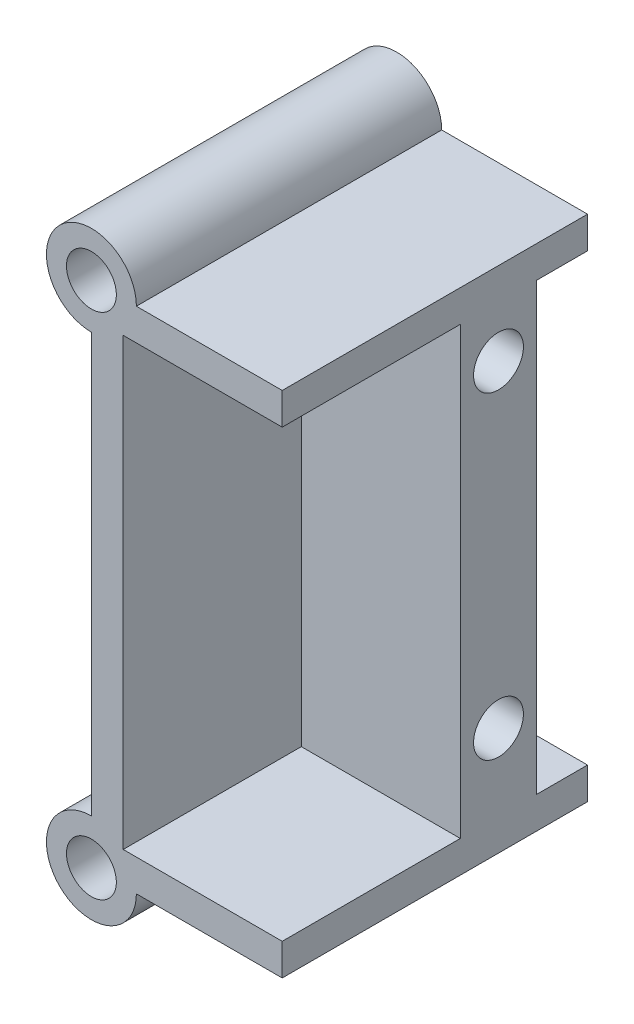
ISO-10303-21;
HEADER;
FILE_DESCRIPTION(('STEP AP214'),'2;1');
FILE_NAME('part.step','',(''),(''),'','','');
FILE_SCHEMA(('AUTOMOTIVE_DESIGN { 1 0 10303 214 1 1 1 1 }'));
ENDSEC;
DATA;
#1=APPLICATION_CONTEXT('core data for automotive mechanical design processes');
#2=APPLICATION_PROTOCOL_DEFINITION('international standard','automotive_design',2000,#1);
#3=PRODUCT_CONTEXT('',#1,'mechanical');
#4=PRODUCT('Part','Part','',(#3));
#5=PRODUCT_RELATED_PRODUCT_CATEGORY('part','',(#4));
#6=PRODUCT_DEFINITION_FORMATION('','',#4);
#7=PRODUCT_DEFINITION_CONTEXT('part definition',#1,'design');
#8=PRODUCT_DEFINITION('design','',#6,#7);
#9=PRODUCT_DEFINITION_SHAPE('','',#8);
#10=(LENGTH_UNIT() NAMED_UNIT(*) SI_UNIT(.MILLI.,.METRE.));
#11=(NAMED_UNIT(*) PLANE_ANGLE_UNIT() SI_UNIT($,.RADIAN.));
#12=(NAMED_UNIT(*) SI_UNIT($,.STERADIAN.) SOLID_ANGLE_UNIT());
#13=UNCERTAINTY_MEASURE_WITH_UNIT(LENGTH_MEASURE(1.E-05),#10,'distance_accuracy_value','');
#14=(GEOMETRIC_REPRESENTATION_CONTEXT(3) GLOBAL_UNCERTAINTY_ASSIGNED_CONTEXT((#13)) GLOBAL_UNIT_ASSIGNED_CONTEXT((#10,
#11,#12)) REPRESENTATION_CONTEXT('',''));
#15=CARTESIAN_POINT('',(0.,0.,0.));
#16=DIRECTION('',(0.,0.,1.));
#17=DIRECTION('',(1.,0.,0.));
#18=AXIS2_PLACEMENT_3D('',#15,#16,#17);
#19=CARTESIAN_POINT('',(0.,0.,30.48));
#20=DIRECTION('',(0.,-1.,0.));
#21=DIRECTION('',(0.,0.,-1.));
#22=AXIS2_PLACEMENT_3D('',#19,#20,#21);
#23=PLANE('',#22);
#24=DIRECTION('',(-1.,0.,0.));
#25=VECTOR('',#24,1.);
#26=CARTESIAN_POINT('',(60.9734134975943,0.,5.08));
#27=LINE('',#26,#25);
#28=CARTESIAN_POINT('',(15.875,0.,5.08));
#29=VERTEX_POINT('',#28);
#30=CARTESIAN_POINT('',(0.,0.,5.08));
#31=VERTEX_POINT('',#30);
#32=EDGE_CURVE('E235',#29,#31,#27,.T.);
#33=ORIENTED_EDGE('',*,*,#32,.F.);
#34=DIRECTION('',(0.,0.,-1.));
#35=VECTOR('',#34,1.);
#36=CARTESIAN_POINT('',(15.875,0.,30.48));
#37=LINE('',#36,#35);
#38=CARTESIAN_POINT('',(15.875,0.,0.));
#39=VERTEX_POINT('',#38);
#40=EDGE_CURVE('E200',#29,#39,#37,.T.);
#41=ORIENTED_EDGE('',*,*,#40,.T.);
#42=DIRECTION('',(-1.,0.,0.));
#43=VECTOR('',#42,1.);
#44=CARTESIAN_POINT('',(0.,0.,0.));
#45=LINE('',#44,#43);
#46=CARTESIAN_POINT('',(0.,0.,0.));
#47=VERTEX_POINT('',#46);
#48=EDGE_CURVE('E169',#39,#47,#45,.T.);
#49=ORIENTED_EDGE('',*,*,#48,.T.);
#50=DIRECTION('',(0.,0.,-1.));
#51=VECTOR('',#50,1.);
#52=CARTESIAN_POINT('',(0.,0.,30.48));
#53=LINE('',#52,#51);
#54=EDGE_CURVE('E196',#31,#47,#53,.T.);
#55=ORIENTED_EDGE('',*,*,#54,.F.);
#56=EDGE_LOOP('',(#33,#41,#49,#55));
#57=FACE_BOUND('',#56,.T.);
#58=ADVANCED_FACE('F37',(#57),#23,.F.);
#59=DIRECTION('',(-1.,0.,0.));
#60=VECTOR('',#59,1.);
#61=CARTESIAN_POINT('',(60.9734134975943,0.,12.7));
#62=LINE('',#61,#60);
#63=CARTESIAN_POINT('',(15.875,0.,12.7));
#64=VERTEX_POINT('',#63);
#65=CARTESIAN_POINT('',(0.,0.,12.7));
#66=VERTEX_POINT('',#65);
#67=EDGE_CURVE('E223',#64,#66,#62,.T.);
#68=ORIENTED_EDGE('',*,*,#67,.T.);
#69=CARTESIAN_POINT('',(0.,0.,30.48));
#70=VERTEX_POINT('',#69);
#71=EDGE_CURVE('E197',#70,#66,#53,.T.);
#72=ORIENTED_EDGE('',*,*,#71,.F.);
#73=DIRECTION('',(-1.,0.,0.));
#74=VECTOR('',#73,1.);
#75=CARTESIAN_POINT('',(0.,0.,30.48));
#76=LINE('',#75,#74);
#77=CARTESIAN_POINT('',(15.875,0.,30.48));
#78=VERTEX_POINT('',#77);
#79=EDGE_CURVE('E254',#78,#70,#76,.T.);
#80=ORIENTED_EDGE('',*,*,#79,.F.);
#81=EDGE_CURVE('E201',#78,#64,#37,.T.);
#82=ORIENTED_EDGE('',*,*,#81,.T.);
#83=EDGE_LOOP('',(#68,#72,#80,#82));
#84=FACE_BOUND('',#83,.T.);
#85=ADVANCED_FACE('F289',(#84),#23,.F.);
#86=CARTESIAN_POINT('',(0.,44.45,30.48));
#87=DIRECTION('',(-1.,0.,0.));
#88=DIRECTION('',(0.,0.,1.));
#89=AXIS2_PLACEMENT_3D('',#86,#87,#88);
#90=PLANE('',#89);
#91=DIRECTION('',(0.,1.,0.));
#92=VECTOR('',#91,1.);
#93=CARTESIAN_POINT('',(0.,0.,5.08));
#94=LINE('',#93,#92);
#95=CARTESIAN_POINT('',(0.,44.45,5.08));
#96=VERTEX_POINT('',#95);
#97=EDGE_CURVE('E229',#31,#96,#94,.T.);
#98=ORIENTED_EDGE('',*,*,#97,.F.);
#99=ORIENTED_EDGE('',*,*,#54,.T.);
#100=DIRECTION('',(0.,1.,0.));
#101=VECTOR('',#100,1.);
#102=CARTESIAN_POINT('',(0.,44.45,0.));
#103=LINE('',#102,#101);
#104=CARTESIAN_POINT('',(0.,44.45,0.));
#105=VERTEX_POINT('',#104);
#106=EDGE_CURVE('E172',#47,#105,#103,.T.);
#107=ORIENTED_EDGE('',*,*,#106,.T.);
#108=DIRECTION('',(0.,0.,-1.));
#109=VECTOR('',#108,1.);
#110=CARTESIAN_POINT('',(0.,44.45,30.48));
#111=LINE('',#110,#109);
#112=EDGE_CURVE('E192',#96,#105,#111,.T.);
#113=ORIENTED_EDGE('',*,*,#112,.F.);
#114=EDGE_LOOP('',(#98,#99,#107,#113));
#115=FACE_BOUND('',#114,.T.);
#116=ADVANCED_FACE('F313',(#115),#90,.F.);
#117=DIRECTION('',(0.,-1.,0.));
#118=VECTOR('',#117,1.);
#119=CARTESIAN_POINT('',(0.,0.,12.7));
#120=LINE('',#119,#118);
#121=CARTESIAN_POINT('',(0.,44.45,12.7));
#122=VERTEX_POINT('',#121);
#123=EDGE_CURVE('E211',#122,#66,#120,.T.);
#124=ORIENTED_EDGE('',*,*,#123,.F.);
#125=CARTESIAN_POINT('',(0.,44.45,30.48));
#126=VERTEX_POINT('',#125);
#127=EDGE_CURVE('E193',#126,#122,#111,.T.);
#128=ORIENTED_EDGE('',*,*,#127,.F.);
#129=DIRECTION('',(0.,1.,0.));
#130=VECTOR('',#129,1.);
#131=CARTESIAN_POINT('',(0.,44.45,30.48));
#132=LINE('',#131,#130);
#133=EDGE_CURVE('E256',#70,#126,#132,.T.);
#134=ORIENTED_EDGE('',*,*,#133,.F.);
#135=ORIENTED_EDGE('',*,*,#71,.T.);
#136=EDGE_LOOP('',(#124,#128,#134,#135));
#137=FACE_BOUND('',#136,.T.);
#138=ADVANCED_FACE('F293',(#137),#90,.F.);
#139=CARTESIAN_POINT('',(0.,44.45,30.48));
#140=DIRECTION('',(0.,1.,0.));
#141=DIRECTION('',(0.,0.,1.));
#142=AXIS2_PLACEMENT_3D('',#139,#140,#141);
#143=PLANE('',#142);
#144=DIRECTION('',(-1.,0.,0.));
#145=VECTOR('',#144,1.);
#146=CARTESIAN_POINT('',(60.9734134975943,44.45,5.08));
#147=LINE('',#146,#145);
#148=CARTESIAN_POINT('',(15.875,44.45,5.08000000000001));
#149=VERTEX_POINT('',#148);
#150=EDGE_CURVE('E54',#149,#96,#147,.T.);
#151=ORIENTED_EDGE('',*,*,#150,.T.);
#152=ORIENTED_EDGE('',*,*,#112,.T.);
#153=DIRECTION('',(1.,0.,0.));
#154=VECTOR('',#153,1.);
#155=CARTESIAN_POINT('',(0.,44.45,0.));
#156=LINE('',#155,#154);
#157=CARTESIAN_POINT('',(15.875,44.45,0.));
#158=VERTEX_POINT('',#157);
#159=EDGE_CURVE('E175',#105,#158,#156,.T.);
#160=ORIENTED_EDGE('',*,*,#159,.T.);
#161=DIRECTION('',(0.,0.,-1.));
#162=VECTOR('',#161,1.);
#163=CARTESIAN_POINT('',(15.875,44.45,30.48));
#164=LINE('',#163,#162);
#165=EDGE_CURVE('E188',#149,#158,#164,.T.);
#166=ORIENTED_EDGE('',*,*,#165,.F.);
#167=EDGE_LOOP('',(#151,#152,#160,#166));
#168=FACE_BOUND('',#167,.T.);
#169=ADVANCED_FACE('F315',(#168),#143,.F.);
#170=DIRECTION('',(-1.,0.,0.));
#171=VECTOR('',#170,1.);
#172=CARTESIAN_POINT('',(60.9734134975943,44.45,12.7));
#173=LINE('',#172,#171);
#174=CARTESIAN_POINT('',(15.875,44.45,12.7));
#175=VERTEX_POINT('',#174);
#176=EDGE_CURVE('E231',#175,#122,#173,.T.);
#177=ORIENTED_EDGE('',*,*,#176,.F.);
#178=CARTESIAN_POINT('',(15.875,44.45,30.48));
#179=VERTEX_POINT('',#178);
#180=EDGE_CURVE('E189',#179,#175,#164,.T.);
#181=ORIENTED_EDGE('',*,*,#180,.F.);
#182=DIRECTION('',(1.,0.,0.));
#183=VECTOR('',#182,1.);
#184=CARTESIAN_POINT('',(0.,44.45,30.48));
#185=LINE('',#184,#183);
#186=EDGE_CURVE('E258',#126,#179,#185,.T.);
#187=ORIENTED_EDGE('',*,*,#186,.F.);
#188=ORIENTED_EDGE('',*,*,#127,.T.);
#189=EDGE_LOOP('',(#177,#181,#187,#188));
#190=FACE_BOUND('',#189,.T.);
#191=ADVANCED_FACE('F265',(#190),#143,.F.);
#192=CARTESIAN_POINT('',(-3.175,-3.175,30.48));
#193=DIRECTION('',(0.,0.,1.));
#194=DIRECTION('',(1.,0.,0.));
#195=AXIS2_PLACEMENT_3D('',#192,#193,#194);
#196=PLANE('',#195);
#197=CARTESIAN_POINT('',(-3.175,47.625,30.48));
#198=DIRECTION('',(0.,0.,1.));
#199=DIRECTION('',(1.,0.,0.));
#200=AXIS2_PLACEMENT_3D('',#197,#198,#199);
#201=CIRCLE('',#200,2.4892);
#202=CARTESIAN_POINT('',(-5.6642,47.625,30.48));
#203=VERTEX_POINT('',#202);
#204=EDGE_CURVE('E164',#203,#203,#201,.T.);
#205=ORIENTED_EDGE('',*,*,#204,.F.);
#206=EDGE_LOOP('',(#205));
#207=FACE_BOUND('',#206,.T.);
#208=CARTESIAN_POINT('',(-3.175,-3.175,30.48));
#209=DIRECTION('',(0.,0.,1.));
#210=DIRECTION('',(1.,0.,0.));
#211=AXIS2_PLACEMENT_3D('',#208,#209,#210);
#212=CIRCLE('',#211,4.49012806053458);
#213=CARTESIAN_POINT('',(-3.175,1.31512806053458,30.48));
#214=VERTEX_POINT('',#213);
#215=CARTESIAN_POINT('',(1.31512806053458,-3.175,30.48));
#216=VERTEX_POINT('',#215);
#217=EDGE_CURVE('E184',#214,#216,#212,.T.);
#218=ORIENTED_EDGE('',*,*,#217,.T.);
#219=DIRECTION('',(1.,0.,0.));
#220=VECTOR('',#219,1.);
#221=CARTESIAN_POINT('',(15.875,-3.175,30.48));
#222=LINE('',#221,#220);
#223=CARTESIAN_POINT('',(15.875,-3.175,30.48));
#224=VERTEX_POINT('',#223);
#225=EDGE_CURVE('E110',#216,#224,#222,.T.);
#226=ORIENTED_EDGE('',*,*,#225,.T.);
#227=DIRECTION('',(0.,1.,0.));
#228=VECTOR('',#227,1.);
#229=CARTESIAN_POINT('',(15.875,0.,30.48));
#230=LINE('',#229,#228);
#231=EDGE_CURVE('E252',#224,#78,#230,.T.);
#232=ORIENTED_EDGE('',*,*,#231,.T.);
#233=ORIENTED_EDGE('',*,*,#79,.T.);
#234=ORIENTED_EDGE('',*,*,#133,.T.);
#235=ORIENTED_EDGE('',*,*,#186,.T.);
#236=DIRECTION('',(0.,1.,0.));
#237=VECTOR('',#236,1.);
#238=CARTESIAN_POINT('',(15.875,47.625,30.48));
#239=LINE('',#238,#237);
#240=CARTESIAN_POINT('',(15.875,47.625,30.48));
#241=VERTEX_POINT('',#240);
#242=EDGE_CURVE('E139',#179,#241,#239,.T.);
#243=ORIENTED_EDGE('',*,*,#242,.T.);
#244=DIRECTION('',(-1.,0.,0.));
#245=VECTOR('',#244,1.);
#246=CARTESIAN_POINT('',(15.875,47.625,30.48));
#247=LINE('',#246,#245);
#248=CARTESIAN_POINT('',(1.31512806053457,47.625,30.48));
#249=VERTEX_POINT('',#248);
#250=EDGE_CURVE('E131',#241,#249,#247,.T.);
#251=ORIENTED_EDGE('',*,*,#250,.T.);
#252=CARTESIAN_POINT('',(-3.175,47.625,30.48));
#253=DIRECTION('',(0.,0.,1.));
#254=DIRECTION('',(1.,0.,0.));
#255=AXIS2_PLACEMENT_3D('',#252,#253,#254);
#256=CIRCLE('',#255,4.49012806053457);
#257=CARTESIAN_POINT('',(-3.175,43.1348719394654,30.48));
#258=VERTEX_POINT('',#257);
#259=EDGE_CURVE('E136',#249,#258,#256,.T.);
#260=ORIENTED_EDGE('',*,*,#259,.T.);
#261=DIRECTION('',(0.,-1.,0.));
#262=VECTOR('',#261,1.);
#263=CARTESIAN_POINT('',(-3.175,43.1348719394654,30.48));
#264=LINE('',#263,#262);
#265=EDGE_CURVE('E63',#258,#214,#264,.T.);
#266=ORIENTED_EDGE('',*,*,#265,.T.);
#267=EDGE_LOOP('',(#218,#226,#232,#233,#234,#235,#243,#251,#260,#266));
#268=FACE_BOUND('',#267,.T.);
#269=CARTESIAN_POINT('',(-3.175,-3.175,30.48));
#270=DIRECTION('',(0.,0.,1.));
#271=DIRECTION('',(1.,0.,0.));
#272=AXIS2_PLACEMENT_3D('',#269,#270,#271);
#273=CIRCLE('',#272,2.4892);
#274=CARTESIAN_POINT('',(-5.6642,-3.175,30.48));
#275=VERTEX_POINT('',#274);
#276=EDGE_CURVE('E240',#275,#275,#273,.T.);
#277=ORIENTED_EDGE('',*,*,#276,.F.);
#278=EDGE_LOOP('',(#277));
#279=FACE_BOUND('',#278,.T.);
#280=ADVANCED_FACE('F133',(#207,#268,#279),#196,.T.);
#281=CARTESIAN_POINT('',(-3.175,-3.175,0.));
#282=DIRECTION('',(0.,0.,1.));
#283=DIRECTION('',(1.,0.,0.));
#284=AXIS2_PLACEMENT_3D('',#281,#282,#283);
#285=PLANE('',#284);
#286=CARTESIAN_POINT('',(-3.175,-3.175,0.));
#287=DIRECTION('',(0.,0.,1.));
#288=DIRECTION('',(1.,0.,0.));
#289=AXIS2_PLACEMENT_3D('',#286,#287,#288);
#290=CIRCLE('',#289,4.49012806053458);
#291=CARTESIAN_POINT('',(-3.175,1.31512806053458,0.));
#292=VERTEX_POINT('',#291);
#293=CARTESIAN_POINT('',(1.31512806053458,-3.175,0.));
#294=VERTEX_POINT('',#293);
#295=EDGE_CURVE('E160',#292,#294,#290,.T.);
#296=ORIENTED_EDGE('',*,*,#295,.F.);
#297=DIRECTION('',(0.,-1.,0.));
#298=VECTOR('',#297,1.);
#299=CARTESIAN_POINT('',(-3.175,43.1348719394654,0.));
#300=LINE('',#299,#298);
#301=CARTESIAN_POINT('',(-3.175,43.1348719394654,0.));
#302=VERTEX_POINT('',#301);
#303=EDGE_CURVE('E102',#302,#292,#300,.T.);
#304=ORIENTED_EDGE('',*,*,#303,.F.);
#305=CARTESIAN_POINT('',(-3.175,47.625,0.));
#306=DIRECTION('',(0.,0.,1.));
#307=DIRECTION('',(1.,0.,0.));
#308=AXIS2_PLACEMENT_3D('',#305,#306,#307);
#309=CIRCLE('',#308,4.49012806053457);
#310=CARTESIAN_POINT('',(1.31512806053457,47.625,0.));
#311=VERTEX_POINT('',#310);
#312=EDGE_CURVE('E181',#311,#302,#309,.T.);
#313=ORIENTED_EDGE('',*,*,#312,.F.);
#314=DIRECTION('',(-1.,0.,0.));
#315=VECTOR('',#314,1.);
#316=CARTESIAN_POINT('',(15.875,47.625,0.));
#317=LINE('',#316,#315);
#318=CARTESIAN_POINT('',(15.875,47.625,0.));
#319=VERTEX_POINT('',#318);
#320=EDGE_CURVE('E148',#319,#311,#317,.T.);
#321=ORIENTED_EDGE('',*,*,#320,.F.);
#322=DIRECTION('',(0.,1.,0.));
#323=VECTOR('',#322,1.);
#324=CARTESIAN_POINT('',(15.875,47.625,0.));
#325=LINE('',#324,#323);
#326=EDGE_CURVE('E178',#158,#319,#325,.T.);
#327=ORIENTED_EDGE('',*,*,#326,.F.);
#328=ORIENTED_EDGE('',*,*,#159,.F.);
#329=ORIENTED_EDGE('',*,*,#106,.F.);
#330=ORIENTED_EDGE('',*,*,#48,.F.);
#331=DIRECTION('',(0.,1.,0.));
#332=VECTOR('',#331,1.);
#333=CARTESIAN_POINT('',(15.875,0.,0.));
#334=LINE('',#333,#332);
#335=CARTESIAN_POINT('',(15.875,-3.175,0.));
#336=VERTEX_POINT('',#335);
#337=EDGE_CURVE('E166',#336,#39,#334,.T.);
#338=ORIENTED_EDGE('',*,*,#337,.F.);
#339=DIRECTION('',(1.,0.,0.));
#340=VECTOR('',#339,1.);
#341=CARTESIAN_POINT('',(15.875,-3.175,0.));
#342=LINE('',#341,#340);
#343=EDGE_CURVE('E163',#294,#336,#342,.T.);
#344=ORIENTED_EDGE('',*,*,#343,.F.);
#345=EDGE_LOOP('',(#296,#304,#313,#321,#327,#328,#329,#330,#338,#344));
#346=FACE_BOUND('',#345,.T.);
#347=CARTESIAN_POINT('',(-3.175,47.625,0.));
#348=DIRECTION('',(0.,0.,1.));
#349=DIRECTION('',(1.,0.,0.));
#350=AXIS2_PLACEMENT_3D('',#347,#348,#349);
#351=CIRCLE('',#350,2.4892);
#352=CARTESIAN_POINT('',(-5.6642,47.625,0.));
#353=VERTEX_POINT('',#352);
#354=EDGE_CURVE('E243',#353,#353,#351,.T.);
#355=ORIENTED_EDGE('',*,*,#354,.T.);
#356=EDGE_LOOP('',(#355));
#357=FACE_BOUND('',#356,.T.);
#358=CARTESIAN_POINT('',(-3.175,-3.175,0.));
#359=DIRECTION('',(0.,0.,1.));
#360=DIRECTION('',(1.,0.,0.));
#361=AXIS2_PLACEMENT_3D('',#358,#359,#360);
#362=CIRCLE('',#361,2.4892);
#363=CARTESIAN_POINT('',(-5.6642,-3.175,0.));
#364=VERTEX_POINT('',#363);
#365=EDGE_CURVE('E226',#364,#364,#362,.T.);
#366=ORIENTED_EDGE('',*,*,#365,.T.);
#367=EDGE_LOOP('',(#366));
#368=FACE_BOUND('',#367,.T.);
#369=ADVANCED_FACE('F273',(#346,#357,#368),#285,.F.);
#370=CARTESIAN_POINT('',(-3.175,-3.175,30.48));
#371=DIRECTION('',(0.,0.,-1.));
#372=DIRECTION('',(-1.,0.,0.));
#373=AXIS2_PLACEMENT_3D('',#370,#371,#372);
#374=CYLINDRICAL_SURFACE('',#373,4.49012806053458);
#375=ORIENTED_EDGE('',*,*,#295,.T.);
#376=DIRECTION('',(0.,0.,-1.));
#377=VECTOR('',#376,1.);
#378=CARTESIAN_POINT('',(1.31512806053458,-3.175,30.48));
#379=LINE('',#378,#377);
#380=EDGE_CURVE('E11',#216,#294,#379,.T.);
#381=ORIENTED_EDGE('',*,*,#380,.F.);
#382=ORIENTED_EDGE('',*,*,#217,.F.);
#383=DIRECTION('',(0.,0.,-1.));
#384=VECTOR('',#383,1.);
#385=CARTESIAN_POINT('',(-3.175,1.31512806053458,30.48));
#386=LINE('',#385,#384);
#387=EDGE_CURVE('E156',#214,#292,#386,.T.);
#388=ORIENTED_EDGE('',*,*,#387,.T.);
#389=EDGE_LOOP('',(#375,#381,#382,#388));
#390=FACE_BOUND('',#389,.T.);
#391=ADVANCED_FACE('F39',(#390),#374,.T.);
#392=CARTESIAN_POINT('',(15.875,-3.175,30.48));
#393=DIRECTION('',(0.,1.,0.));
#394=DIRECTION('',(-1.,0.,0.));
#395=AXIS2_PLACEMENT_3D('',#392,#393,#394);
#396=PLANE('',#395);
#397=ORIENTED_EDGE('',*,*,#343,.T.);
#398=DIRECTION('',(0.,0.,-1.));
#399=VECTOR('',#398,1.);
#400=CARTESIAN_POINT('',(15.875,-3.175,30.48));
#401=LINE('',#400,#399);
#402=EDGE_CURVE('E46',#224,#336,#401,.T.);
#403=ORIENTED_EDGE('',*,*,#402,.F.);
#404=ORIENTED_EDGE('',*,*,#225,.F.);
#405=ORIENTED_EDGE('',*,*,#380,.T.);
#406=EDGE_LOOP('',(#397,#403,#404,#405));
#407=FACE_BOUND('',#406,.T.);
#408=ADVANCED_FACE('F282',(#407),#396,.F.);
#409=CARTESIAN_POINT('',(15.875,47.625,30.48));
#410=DIRECTION('',(-1.,0.,0.));
#411=DIRECTION('',(0.,0.,1.));
#412=AXIS2_PLACEMENT_3D('',#409,#410,#411);
#413=PLANE('',#412);
#414=CARTESIAN_POINT('',(15.875,7.61999999999997,8.89000000000001));
#415=DIRECTION('',(1.,0.,0.));
#416=DIRECTION('',(0.,0.,-1.));
#417=AXIS2_PLACEMENT_3D('',#414,#415,#416);
#418=CIRCLE('',#417,2.4892);
#419=CARTESIAN_POINT('',(15.875,7.61999999999997,6.40080000000002));
#420=VERTEX_POINT('',#419);
#421=EDGE_CURVE('E207',#420,#420,#418,.T.);
#422=ORIENTED_EDGE('',*,*,#421,.F.);
#423=EDGE_LOOP('',(#422));
#424=FACE_BOUND('',#423,.T.);
#425=CARTESIAN_POINT('',(15.875,39.37,8.89000000000001));
#426=DIRECTION('',(1.,0.,0.));
#427=DIRECTION('',(0.,0.,-1.));
#428=AXIS2_PLACEMENT_3D('',#425,#426,#427);
#429=CIRCLE('',#428,2.4892);
#430=CARTESIAN_POINT('',(15.875,39.37,6.40080000000001));
#431=VERTEX_POINT('',#430);
#432=EDGE_CURVE('E213',#431,#431,#429,.T.);
#433=ORIENTED_EDGE('',*,*,#432,.F.);
#434=EDGE_LOOP('',(#433));
#435=FACE_BOUND('',#434,.T.);
#436=ORIENTED_EDGE('',*,*,#326,.T.);
#437=DIRECTION('',(0.,0.,-1.));
#438=VECTOR('',#437,1.);
#439=CARTESIAN_POINT('',(15.875,47.625,30.48));
#440=LINE('',#439,#438);
#441=EDGE_CURVE('E151',#241,#319,#440,.T.);
#442=ORIENTED_EDGE('',*,*,#441,.F.);
#443=ORIENTED_EDGE('',*,*,#242,.F.);
#444=ORIENTED_EDGE('',*,*,#180,.T.);
#445=DIRECTION('',(0.,1.,0.));
#446=VECTOR('',#445,1.);
#447=CARTESIAN_POINT('',(15.875,0.,12.7));
#448=LINE('',#447,#446);
#449=EDGE_CURVE('E222',#64,#175,#448,.T.);
#450=ORIENTED_EDGE('',*,*,#449,.F.);
#451=ORIENTED_EDGE('',*,*,#81,.F.);
#452=ORIENTED_EDGE('',*,*,#231,.F.);
#453=ORIENTED_EDGE('',*,*,#402,.T.);
#454=ORIENTED_EDGE('',*,*,#337,.T.);
#455=ORIENTED_EDGE('',*,*,#40,.F.);
#456=DIRECTION('',(0.,-1.,0.));
#457=VECTOR('',#456,1.);
#458=CARTESIAN_POINT('',(15.875,0.,5.08));
#459=LINE('',#458,#457);
#460=EDGE_CURVE('E220',#149,#29,#459,.T.);
#461=ORIENTED_EDGE('',*,*,#460,.F.);
#462=ORIENTED_EDGE('',*,*,#165,.T.);
#463=EDGE_LOOP('',(#436,#442,#443,#444,#450,#451,#452,#453,#454,#455,#461,#462));
#464=FACE_BOUND('',#463,.T.);
#465=ADVANCED_FACE('F269',(#424,#435,#464),#413,.F.);
#466=CARTESIAN_POINT('',(15.875,47.625,30.48));
#467=DIRECTION('',(0.,-1.,0.));
#468=DIRECTION('',(0.,0.,-1.));
#469=AXIS2_PLACEMENT_3D('',#466,#467,#468);
#470=PLANE('',#469);
#471=ORIENTED_EDGE('',*,*,#320,.T.);
#472=DIRECTION('',(0.,0.,-1.));
#473=VECTOR('',#472,1.);
#474=CARTESIAN_POINT('',(1.31512806053457,47.625,30.48));
#475=LINE('',#474,#473);
#476=EDGE_CURVE('E145',#249,#311,#475,.T.);
#477=ORIENTED_EDGE('',*,*,#476,.F.);
#478=ORIENTED_EDGE('',*,*,#250,.F.);
#479=ORIENTED_EDGE('',*,*,#441,.T.);
#480=EDGE_LOOP('',(#471,#477,#478,#479));
#481=FACE_BOUND('',#480,.T.);
#482=ADVANCED_FACE('F146',(#481),#470,.F.);
#483=CARTESIAN_POINT('',(-3.175,47.625,30.48));
#484=DIRECTION('',(0.,0.,-1.));
#485=DIRECTION('',(-1.,0.,0.));
#486=AXIS2_PLACEMENT_3D('',#483,#484,#485);
#487=CYLINDRICAL_SURFACE('',#486,4.49012806053457);
#488=ORIENTED_EDGE('',*,*,#312,.T.);
#489=DIRECTION('',(0.,0.,-1.));
#490=VECTOR('',#489,1.);
#491=CARTESIAN_POINT('',(-3.175,43.1348719394654,30.48));
#492=LINE('',#491,#490);
#493=EDGE_CURVE('E152',#258,#302,#492,.T.);
#494=ORIENTED_EDGE('',*,*,#493,.F.);
#495=ORIENTED_EDGE('',*,*,#259,.F.);
#496=ORIENTED_EDGE('',*,*,#476,.T.);
#497=EDGE_LOOP('',(#488,#494,#495,#496));
#498=FACE_BOUND('',#497,.T.);
#499=ADVANCED_FACE('F154',(#498),#487,.T.);
#500=CARTESIAN_POINT('',(-3.175,43.1348719394654,30.48));
#501=DIRECTION('',(1.,0.,0.));
#502=DIRECTION('',(0.,1.,0.));
#503=AXIS2_PLACEMENT_3D('',#500,#501,#502);
#504=PLANE('',#503);
#505=CARTESIAN_POINT('',(-3.175,7.61999999999997,8.89000000000001));
#506=DIRECTION('',(1.,0.,0.));
#507=DIRECTION('',(0.,1.,0.));
#508=AXIS2_PLACEMENT_3D('',#505,#506,#507);
#509=CIRCLE('',#508,2.4892);
#510=CARTESIAN_POINT('',(-3.175,10.1092,8.89000000000001));
#511=VERTEX_POINT('',#510);
#512=EDGE_CURVE('E41',#511,#511,#509,.T.);
#513=ORIENTED_EDGE('',*,*,#512,.T.);
#514=EDGE_LOOP('',(#513));
#515=FACE_BOUND('',#514,.T.);
#516=CARTESIAN_POINT('',(-3.175,39.37,8.89000000000001));
#517=DIRECTION('',(1.,0.,0.));
#518=DIRECTION('',(0.,1.,0.));
#519=AXIS2_PLACEMENT_3D('',#516,#517,#518);
#520=CIRCLE('',#519,2.4892);
#521=CARTESIAN_POINT('',(-3.175,41.8592,8.89000000000001));
#522=VERTEX_POINT('',#521);
#523=EDGE_CURVE('E205',#522,#522,#520,.T.);
#524=ORIENTED_EDGE('',*,*,#523,.T.);
#525=EDGE_LOOP('',(#524));
#526=FACE_BOUND('',#525,.T.);
#527=ORIENTED_EDGE('',*,*,#303,.T.);
#528=ORIENTED_EDGE('',*,*,#387,.F.);
#529=ORIENTED_EDGE('',*,*,#265,.F.);
#530=ORIENTED_EDGE('',*,*,#493,.T.);
#531=EDGE_LOOP('',(#527,#528,#529,#530));
#532=FACE_BOUND('',#531,.T.);
#533=ADVANCED_FACE('F276',(#515,#526,#532),#504,.F.);
#534=CARTESIAN_POINT('',(-3.175,47.625,30.48));
#535=DIRECTION('',(0.,0.,-1.));
#536=DIRECTION('',(-1.,0.,0.));
#537=AXIS2_PLACEMENT_3D('',#534,#535,#536);
#538=CYLINDRICAL_SURFACE('',#537,2.4892);
#539=CARTESIAN_POINT('',(-5.6642,47.625,30.48));
#540=CARTESIAN_POINT('',(-5.6642,47.625,30.1625));
#541=CARTESIAN_POINT('',(-5.6642,47.625,29.845));
#542=CARTESIAN_POINT('',(-5.6642,47.625,29.21));
#543=CARTESIAN_POINT('',(-5.6642,47.625,28.8925));
#544=CARTESIAN_POINT('',(-5.6642,47.625,28.2575));
#545=CARTESIAN_POINT('',(-5.6642,47.625,27.94));
#546=CARTESIAN_POINT('',(-5.6642,47.625,27.305));
#547=CARTESIAN_POINT('',(-5.6642,47.625,26.9875));
#548=CARTESIAN_POINT('',(-5.6642,47.625,26.3525));
#549=CARTESIAN_POINT('',(-5.6642,47.625,26.035));
#550=CARTESIAN_POINT('',(-5.6642,47.625,25.4));
#551=CARTESIAN_POINT('',(-5.6642,47.625,25.0825));
#552=CARTESIAN_POINT('',(-5.6642,47.625,24.4475));
#553=CARTESIAN_POINT('',(-5.6642,47.625,24.13));
#554=CARTESIAN_POINT('',(-5.6642,47.625,23.495));
#555=CARTESIAN_POINT('',(-5.6642,47.625,23.1775));
#556=CARTESIAN_POINT('',(-5.6642,47.625,22.5425));
#557=CARTESIAN_POINT('',(-5.6642,47.625,22.225));
#558=CARTESIAN_POINT('',(-5.6642,47.625,21.59));
#559=CARTESIAN_POINT('',(-5.6642,47.625,21.2725));
#560=CARTESIAN_POINT('',(-5.6642,47.625,20.6375));
#561=CARTESIAN_POINT('',(-5.6642,47.625,20.32));
#562=CARTESIAN_POINT('',(-5.6642,47.625,19.685));
#563=CARTESIAN_POINT('',(-5.6642,47.625,19.3675));
#564=CARTESIAN_POINT('',(-5.6642,47.625,18.7325));
#565=CARTESIAN_POINT('',(-5.6642,47.625,18.415));
#566=CARTESIAN_POINT('',(-5.6642,47.625,17.78));
#567=CARTESIAN_POINT('',(-5.6642,47.625,17.4625));
#568=CARTESIAN_POINT('',(-5.6642,47.625,16.8275));
#569=CARTESIAN_POINT('',(-5.6642,47.625,16.51));
#570=CARTESIAN_POINT('',(-5.6642,47.625,15.875));
#571=CARTESIAN_POINT('',(-5.6642,47.625,15.5575));
#572=CARTESIAN_POINT('',(-5.6642,47.625,14.9225));
#573=CARTESIAN_POINT('',(-5.6642,47.625,14.605));
#574=CARTESIAN_POINT('',(-5.6642,47.625,13.97));
#575=CARTESIAN_POINT('',(-5.6642,47.625,13.6525));
#576=CARTESIAN_POINT('',(-5.6642,47.625,13.0175));
#577=CARTESIAN_POINT('',(-5.6642,47.625,12.7));
#578=CARTESIAN_POINT('',(-5.6642,47.625,12.065));
#579=CARTESIAN_POINT('',(-5.6642,47.625,11.7475));
#580=CARTESIAN_POINT('',(-5.6642,47.625,11.1125));
#581=CARTESIAN_POINT('',(-5.6642,47.625,10.795));
#582=CARTESIAN_POINT('',(-5.6642,47.625,10.16));
#583=CARTESIAN_POINT('',(-5.6642,47.625,9.8425));
#584=CARTESIAN_POINT('',(-5.6642,47.625,9.2075));
#585=CARTESIAN_POINT('',(-5.6642,47.625,8.89));
#586=CARTESIAN_POINT('',(-5.6642,47.625,8.255));
#587=CARTESIAN_POINT('',(-5.6642,47.625,7.9375));
#588=CARTESIAN_POINT('',(-5.6642,47.625,7.3025));
#589=CARTESIAN_POINT('',(-5.6642,47.625,6.985));
#590=CARTESIAN_POINT('',(-5.6642,47.625,6.35));
#591=CARTESIAN_POINT('',(-5.6642,47.625,6.0325));
#592=CARTESIAN_POINT('',(-5.6642,47.625,5.3975));
#593=CARTESIAN_POINT('',(-5.6642,47.625,5.08));
#594=CARTESIAN_POINT('',(-5.6642,47.625,4.445));
#595=CARTESIAN_POINT('',(-5.6642,47.625,4.1275));
#596=CARTESIAN_POINT('',(-5.6642,47.625,3.4925));
#597=CARTESIAN_POINT('',(-5.6642,47.625,3.175));
#598=CARTESIAN_POINT('',(-5.6642,47.625,2.54));
#599=CARTESIAN_POINT('',(-5.6642,47.625,2.2225));
#600=CARTESIAN_POINT('',(-5.6642,47.625,1.5875));
#601=CARTESIAN_POINT('',(-5.6642,47.625,1.27));
#602=CARTESIAN_POINT('',(-5.6642,47.625,0.634999999999999));
#603=CARTESIAN_POINT('',(-5.6642,47.625,0.3175));
#604=CARTESIAN_POINT('',(-5.6642,47.625,0.));
#605=B_SPLINE_CURVE_WITH_KNOTS('',3,(#539,#540,#541,#542,#543,#544,#545,#546,#547,#548,#549,
#550,#551,#552,#553,#554,#555,#556,#557,#558,#559,#560,#561,#562,#563,#564,#565,#566,#567,#568,
#569,#570,#571,#572,#573,#574,#575,#576,#577,#578,#579,#580,#581,#582,#583,#584,#585,#586,#587,
#588,#589,#590,#591,#592,#593,#594,#595,#596,#597,#598,#599,#600,#601,#602,#603,#604),
.UNSPECIFIED.,.F.,.F.,(4,2,2,2,2,2,2,2,2,2,2,2,2,2,2,2,2,2,2,2,2,2,2,2,2,2,2,2,2,2,2,2,4),(0.,
0.952499999999998,1.905,2.8575,3.81,4.7625,5.715,6.6675,7.61999999999999,8.5725,9.525,10.4775,
11.43,12.3825,13.335,14.2875,15.24,16.1925,17.145,18.0975,19.05,20.0025,20.955,21.9075,22.86,
23.8125,24.765,25.7175,26.67,27.6225,28.575,29.5275,30.48),.UNSPECIFIED.);
#606=EDGE_CURVE('BSEAM348',#203,#353,#605,.T.);
#607=ORIENTED_EDGE('',*,*,#204,.T.);
#608=ORIENTED_EDGE('',*,*,#354,.F.);
#609=ORIENTED_EDGE('',*,*,#606,.T.);
#610=ORIENTED_EDGE('',*,*,#606,.F.);
#611=EDGE_LOOP('',(#607,#609,#608,#610));
#612=FACE_BOUND('',#611,.T.);
#613=ADVANCED_FACE('F348',(#612),#538,.F.);
#614=CARTESIAN_POINT('',(-3.175,-3.175,30.48));
#615=DIRECTION('',(0.,0.,-1.));
#616=DIRECTION('',(-1.,0.,0.));
#617=AXIS2_PLACEMENT_3D('',#614,#615,#616);
#618=CYLINDRICAL_SURFACE('',#617,2.4892);
#619=CARTESIAN_POINT('',(-5.6642,-3.175,30.48));
#620=CARTESIAN_POINT('',(-5.6642,-3.175,30.1625));
#621=CARTESIAN_POINT('',(-5.6642,-3.175,29.845));
#622=CARTESIAN_POINT('',(-5.6642,-3.175,29.21));
#623=CARTESIAN_POINT('',(-5.6642,-3.175,28.8925));
#624=CARTESIAN_POINT('',(-5.6642,-3.175,28.2575));
#625=CARTESIAN_POINT('',(-5.6642,-3.175,27.94));
#626=CARTESIAN_POINT('',(-5.6642,-3.175,27.305));
#627=CARTESIAN_POINT('',(-5.6642,-3.175,26.9875));
#628=CARTESIAN_POINT('',(-5.6642,-3.175,26.3525));
#629=CARTESIAN_POINT('',(-5.6642,-3.175,26.035));
#630=CARTESIAN_POINT('',(-5.6642,-3.175,25.4));
#631=CARTESIAN_POINT('',(-5.6642,-3.175,25.0825));
#632=CARTESIAN_POINT('',(-5.6642,-3.175,24.4475));
#633=CARTESIAN_POINT('',(-5.6642,-3.175,24.13));
#634=CARTESIAN_POINT('',(-5.6642,-3.175,23.495));
#635=CARTESIAN_POINT('',(-5.6642,-3.175,23.1775));
#636=CARTESIAN_POINT('',(-5.6642,-3.175,22.5425));
#637=CARTESIAN_POINT('',(-5.6642,-3.175,22.225));
#638=CARTESIAN_POINT('',(-5.6642,-3.175,21.59));
#639=CARTESIAN_POINT('',(-5.6642,-3.175,21.2725));
#640=CARTESIAN_POINT('',(-5.6642,-3.175,20.6375));
#641=CARTESIAN_POINT('',(-5.6642,-3.175,20.32));
#642=CARTESIAN_POINT('',(-5.6642,-3.175,19.685));
#643=CARTESIAN_POINT('',(-5.6642,-3.175,19.3675));
#644=CARTESIAN_POINT('',(-5.6642,-3.175,18.7325));
#645=CARTESIAN_POINT('',(-5.6642,-3.175,18.415));
#646=CARTESIAN_POINT('',(-5.6642,-3.175,17.78));
#647=CARTESIAN_POINT('',(-5.6642,-3.175,17.4625));
#648=CARTESIAN_POINT('',(-5.6642,-3.175,16.8275));
#649=CARTESIAN_POINT('',(-5.6642,-3.175,16.51));
#650=CARTESIAN_POINT('',(-5.6642,-3.175,15.875));
#651=CARTESIAN_POINT('',(-5.6642,-3.175,15.5575));
#652=CARTESIAN_POINT('',(-5.6642,-3.175,14.9225));
#653=CARTESIAN_POINT('',(-5.6642,-3.175,14.605));
#654=CARTESIAN_POINT('',(-5.6642,-3.175,13.97));
#655=CARTESIAN_POINT('',(-5.6642,-3.175,13.6525));
#656=CARTESIAN_POINT('',(-5.6642,-3.175,13.0175));
#657=CARTESIAN_POINT('',(-5.6642,-3.175,12.7));
#658=CARTESIAN_POINT('',(-5.6642,-3.175,12.065));
#659=CARTESIAN_POINT('',(-5.6642,-3.175,11.7475));
#660=CARTESIAN_POINT('',(-5.6642,-3.175,11.1125));
#661=CARTESIAN_POINT('',(-5.6642,-3.175,10.795));
#662=CARTESIAN_POINT('',(-5.6642,-3.175,10.16));
#663=CARTESIAN_POINT('',(-5.6642,-3.175,9.8425));
#664=CARTESIAN_POINT('',(-5.6642,-3.175,9.2075));
#665=CARTESIAN_POINT('',(-5.6642,-3.175,8.89));
#666=CARTESIAN_POINT('',(-5.6642,-3.175,8.255));
#667=CARTESIAN_POINT('',(-5.6642,-3.175,7.9375));
#668=CARTESIAN_POINT('',(-5.6642,-3.175,7.3025));
#669=CARTESIAN_POINT('',(-5.6642,-3.175,6.985));
#670=CARTESIAN_POINT('',(-5.6642,-3.175,6.35));
#671=CARTESIAN_POINT('',(-5.6642,-3.175,6.0325));
#672=CARTESIAN_POINT('',(-5.6642,-3.175,5.3975));
#673=CARTESIAN_POINT('',(-5.6642,-3.175,5.08));
#674=CARTESIAN_POINT('',(-5.6642,-3.175,4.445));
#675=CARTESIAN_POINT('',(-5.6642,-3.175,4.1275));
#676=CARTESIAN_POINT('',(-5.6642,-3.175,3.4925));
#677=CARTESIAN_POINT('',(-5.6642,-3.175,3.175));
#678=CARTESIAN_POINT('',(-5.6642,-3.175,2.54));
#679=CARTESIAN_POINT('',(-5.6642,-3.175,2.2225));
#680=CARTESIAN_POINT('',(-5.6642,-3.175,1.5875));
#681=CARTESIAN_POINT('',(-5.6642,-3.175,1.27));
#682=CARTESIAN_POINT('',(-5.6642,-3.175,0.634999999999999));
#683=CARTESIAN_POINT('',(-5.6642,-3.175,0.3175));
#684=CARTESIAN_POINT('',(-5.6642,-3.175,0.));
#685=B_SPLINE_CURVE_WITH_KNOTS('',3,(#619,#620,#621,#622,#623,#624,#625,#626,#627,#628,#629,
#630,#631,#632,#633,#634,#635,#636,#637,#638,#639,#640,#641,#642,#643,#644,#645,#646,#647,#648,
#649,#650,#651,#652,#653,#654,#655,#656,#657,#658,#659,#660,#661,#662,#663,#664,#665,#666,#667,
#668,#669,#670,#671,#672,#673,#674,#675,#676,#677,#678,#679,#680,#681,#682,#683,#684),
.UNSPECIFIED.,.F.,.F.,(4,2,2,2,2,2,2,2,2,2,2,2,2,2,2,2,2,2,2,2,2,2,2,2,2,2,2,2,2,2,2,2,4),(0.,
0.952499999999998,1.905,2.8575,3.81,4.7625,5.715,6.6675,7.61999999999999,8.5725,9.525,10.4775,
11.43,12.3825,13.335,14.2875,15.24,16.1925,17.145,18.0975,19.05,20.0025,20.955,21.9075,22.86,
23.8125,24.765,25.7175,26.67,27.6225,28.575,29.5275,30.48),.UNSPECIFIED.);
#686=EDGE_CURVE('BSEAM374',#275,#364,#685,.T.);
#687=ORIENTED_EDGE('',*,*,#276,.T.);
#688=ORIENTED_EDGE('',*,*,#365,.F.);
#689=ORIENTED_EDGE('',*,*,#686,.T.);
#690=ORIENTED_EDGE('',*,*,#686,.F.);
#691=EDGE_LOOP('',(#687,#689,#688,#690));
#692=FACE_BOUND('',#691,.T.);
#693=ADVANCED_FACE('F374',(#692),#618,.F.);
#694=CARTESIAN_POINT('',(60.9734134975943,0.,5.08));
#695=DIRECTION('',(0.,0.,1.));
#696=DIRECTION('',(1.,0.,0.));
#697=AXIS2_PLACEMENT_3D('',#694,#695,#696);
#698=PLANE('',#697);
#699=ORIENTED_EDGE('',*,*,#150,.F.);
#700=ORIENTED_EDGE('',*,*,#460,.T.);
#701=ORIENTED_EDGE('',*,*,#32,.T.);
#702=ORIENTED_EDGE('',*,*,#97,.T.);
#703=EDGE_LOOP('',(#699,#700,#701,#702));
#704=FACE_BOUND('',#703,.T.);
#705=ADVANCED_FACE('F303',(#704),#698,.F.);
#706=CARTESIAN_POINT('',(60.9734134975943,0.,12.7));
#707=DIRECTION('',(0.,0.,-1.));
#708=DIRECTION('',(-1.,0.,0.));
#709=AXIS2_PLACEMENT_3D('',#706,#707,#708);
#710=PLANE('',#709);
#711=ORIENTED_EDGE('',*,*,#67,.F.);
#712=ORIENTED_EDGE('',*,*,#449,.T.);
#713=ORIENTED_EDGE('',*,*,#176,.T.);
#714=ORIENTED_EDGE('',*,*,#123,.T.);
#715=EDGE_LOOP('',(#711,#712,#713,#714));
#716=FACE_BOUND('',#715,.T.);
#717=ADVANCED_FACE('F390',(#716),#710,.F.);
#718=CARTESIAN_POINT('',(-7.66512806053457,39.37,8.89000000000001));
#719=DIRECTION('',(1.,0.,0.));
#720=DIRECTION('',(0.,0.,-1.));
#721=AXIS2_PLACEMENT_3D('',#718,#719,#720);
#722=CYLINDRICAL_SURFACE('',#721,2.4892);
#723=ORIENTED_EDGE('',*,*,#432,.T.);
#724=EDGE_LOOP('',(#723));
#725=FACE_BOUND('',#724,.T.);
#726=ORIENTED_EDGE('',*,*,#523,.F.);
#727=EDGE_LOOP('',(#726));
#728=FACE_BOUND('',#727,.T.);
#729=ADVANCED_FACE('F398',(#725,#728),#722,.F.);
#730=CARTESIAN_POINT('',(-7.66512806053457,7.61999999999997,8.89000000000001));
#731=DIRECTION('',(1.,0.,0.));
#732=DIRECTION('',(0.,0.,-1.));
#733=AXIS2_PLACEMENT_3D('',#730,#731,#732);
#734=CYLINDRICAL_SURFACE('',#733,2.4892);
#735=ORIENTED_EDGE('',*,*,#421,.T.);
#736=EDGE_LOOP('',(#735));
#737=FACE_BOUND('',#736,.T.);
#738=ORIENTED_EDGE('',*,*,#512,.F.);
#739=EDGE_LOOP('',(#738));
#740=FACE_BOUND('',#739,.T.);
#741=ADVANCED_FACE('F406',(#737,#740),#734,.F.);
#742=CLOSED_SHELL('',(#58,#85,#116,#138,#169,#191,#280,#369,#391,#408,#465,#482,#499,#533,#613,
#693,#705,#717,#729,#741));
#743=MANIFOLD_SOLID_BREP('B2',#742);
#744=ADVANCED_BREP_SHAPE_REPRESENTATION('',(#18,#743),#14);
#745=SHAPE_DEFINITION_REPRESENTATION(#9,#744);
ENDSEC;
END-ISO-10303-21;
